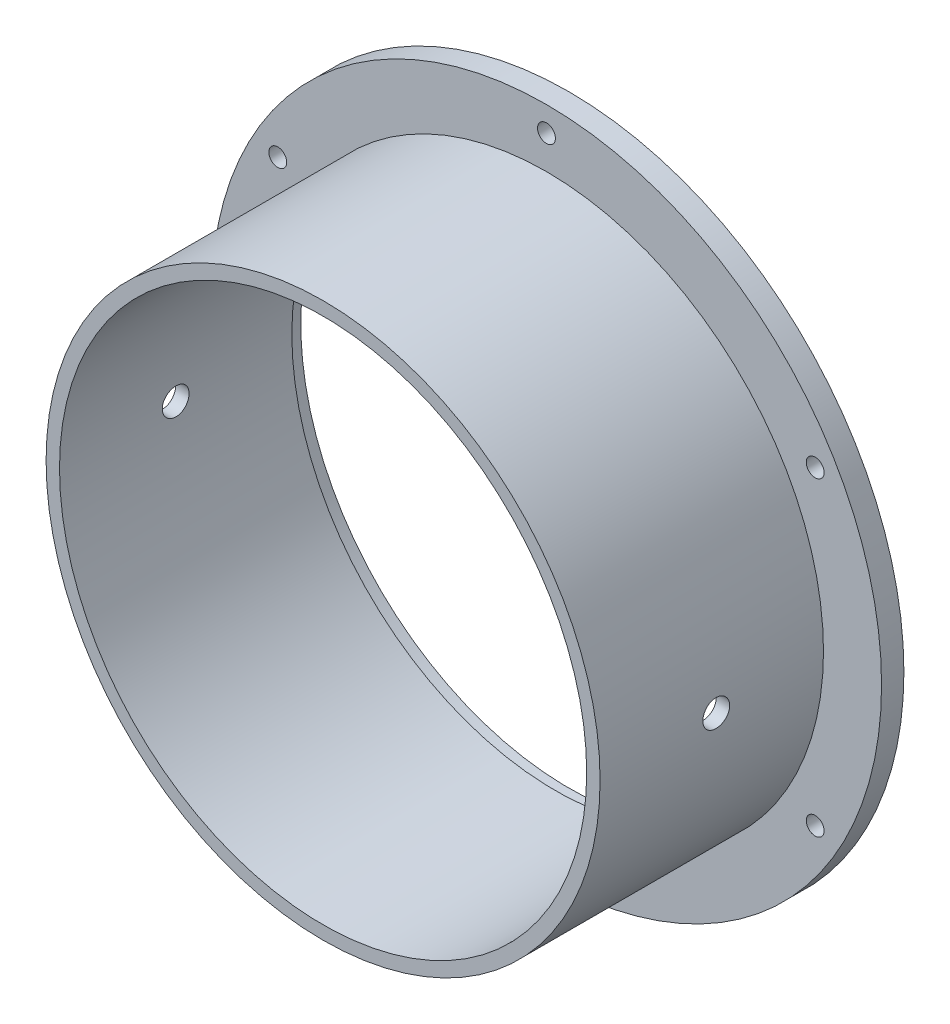
ISO-10303-21;
HEADER;
FILE_DESCRIPTION(('STEP AP214'),'2;1');
FILE_NAME('part.step','',(''),(''),'','','');
FILE_SCHEMA(('AUTOMOTIVE_DESIGN { 1 0 10303 214 1 1 1 1 }'));
ENDSEC;
DATA;
#1=APPLICATION_CONTEXT('core data for automotive mechanical design processes');
#2=APPLICATION_PROTOCOL_DEFINITION('international standard','automotive_design',2000,#1);
#3=PRODUCT_CONTEXT('',#1,'mechanical');
#4=PRODUCT('Part','Part','',(#3));
#5=PRODUCT_RELATED_PRODUCT_CATEGORY('part','',(#4));
#6=PRODUCT_DEFINITION_FORMATION('','',#4);
#7=PRODUCT_DEFINITION_CONTEXT('part definition',#1,'design');
#8=PRODUCT_DEFINITION('design','',#6,#7);
#9=PRODUCT_DEFINITION_SHAPE('','',#8);
#10=(LENGTH_UNIT() NAMED_UNIT(*) SI_UNIT(.MILLI.,.METRE.));
#11=(NAMED_UNIT(*) PLANE_ANGLE_UNIT() SI_UNIT($,.RADIAN.));
#12=(NAMED_UNIT(*) SI_UNIT($,.STERADIAN.) SOLID_ANGLE_UNIT());
#13=UNCERTAINTY_MEASURE_WITH_UNIT(LENGTH_MEASURE(1.E-05),#10,'distance_accuracy_value','');
#14=(GEOMETRIC_REPRESENTATION_CONTEXT(3) GLOBAL_UNCERTAINTY_ASSIGNED_CONTEXT((#13)) GLOBAL_UNIT_ASSIGNED_CONTEXT((#10,
#11,#12)) REPRESENTATION_CONTEXT('',''));
#15=CARTESIAN_POINT('',(0.,0.,0.));
#16=DIRECTION('',(0.,0.,1.));
#17=DIRECTION('',(1.,0.,0.));
#18=AXIS2_PLACEMENT_3D('',#15,#16,#17);
#19=CARTESIAN_POINT('',(0.,0.,3.));
#20=DIRECTION('',(0.,0.,1.));
#21=DIRECTION('',(1.,0.,0.));
#22=AXIS2_PLACEMENT_3D('',#19,#20,#21);
#23=CYLINDRICAL_SURFACE('',#22,62.);
#24=CARTESIAN_POINT('',(62.,0.,25.9999999999981));
#25=CARTESIAN_POINT('',(61.9999990282705,0.168405584694426,26.0000074346546));
#26=CARTESIAN_POINT('',(61.9993065105293,0.33693076786926,26.0142278434654));
#27=CARTESIAN_POINT('',(61.9966104956388,0.669332613043629,26.0707544795158));
#28=CARTESIAN_POINT('',(61.994605451777,0.833203552354285,26.1130938436714));
#29=CARTESIAN_POINT('',(61.9895113347211,1.15143361216737,26.2246437688027));
#30=CARTESIAN_POINT('',(61.9864228118654,1.30579751493346,26.2938406897427));
#31=CARTESIAN_POINT('',(61.9795096323139,1.60067684945553,26.4571206584221));
#32=CARTESIAN_POINT('',(61.9756851500363,1.74119555053847,26.5511978116615));
#33=CARTESIAN_POINT('',(61.9677262379046,2.00457187204135,26.7616680497545));
#34=CARTESIAN_POINT('',(61.9635915521005,2.12741465867416,26.8780796889642));
#35=CARTESIAN_POINT('',(61.9554804474584,2.351825768608,27.1298775764546));
#36=CARTESIAN_POINT('',(61.9515040350745,2.45339322505137,27.2652645975072));
#37=CARTESIAN_POINT('',(61.9441560964872,2.63241060479884,27.5512468427099));
#38=CARTESIAN_POINT('',(61.9407848579203,2.70984907249617,27.7018492458003));
#39=CARTESIAN_POINT('',(61.9350305143315,2.83833674745465,28.0139366426681));
#40=CARTESIAN_POINT('',(61.9326474021629,2.88938614558114,28.1754215577255));
#41=CARTESIAN_POINT('',(61.9291403397868,2.9636077332466,28.5045547029968));
#42=CARTESIAN_POINT('',(61.9280153955046,2.98680193216924,28.6721979591951));
#43=CARTESIAN_POINT('',(61.9271485401869,3.00472262423346,29.0090019623375));
#44=CARTESIAN_POINT('',(61.9274066187725,2.99944933100826,29.1781626978841));
#45=CARTESIAN_POINT('',(61.9292757819943,2.96060307563245,29.5130502429787));
#46=CARTESIAN_POINT('',(61.9308857297982,2.92705389153749,29.6787798179555));
#47=CARTESIAN_POINT('',(61.9352753809049,2.83264503613975,30.002252086115));
#48=CARTESIAN_POINT('',(61.9380550889164,2.77178525489684,30.1599947471431));
#49=CARTESIAN_POINT('',(61.9444722682625,2.62445561961246,30.4630920660385));
#50=CARTESIAN_POINT('',(61.9481101027522,2.53797491893829,30.6084414435716));
#51=CARTESIAN_POINT('',(61.955833137302,2.34186622526503,30.8825684973078));
#52=CARTESIAN_POINT('',(61.9599183403076,2.23223807985428,31.0113460643868));
#53=CARTESIAN_POINT('',(61.9680807151099,1.99281222336997,31.2488123792169));
#54=CARTESIAN_POINT('',(61.9721578743543,1.86299391935563,31.3574803656144));
#55=CARTESIAN_POINT('',(61.9798405768126,1.58694520703647,31.5514828675083));
#56=CARTESIAN_POINT('',(61.9834461199151,1.44071479485751,31.6368173774967));
#57=CARTESIAN_POINT('',(61.989779377416,1.1359807219657,31.781728572622));
#58=CARTESIAN_POINT('',(61.9925070673636,0.977476719551079,31.8413045403264));
#59=CARTESIAN_POINT('',(61.9967768376709,0.652700178909521,31.9329939694224));
#60=CARTESIAN_POINT('',(61.9983189263457,0.486427695175188,31.9651076234202));
#61=CARTESIAN_POINT('',(62.0000426262719,0.151014309244486,32.0009352627698));
#62=CARTESIAN_POINT('',(62.000225613243,-0.0181235186543107,32.0046779660508));
#63=CARTESIAN_POINT('',(61.9992141381796,-0.354624832727654,31.9837323961819));
#64=CARTESIAN_POINT('',(61.9980196804066,-0.521988324389978,31.9590442109908));
#65=CARTESIAN_POINT('',(61.9943887444586,-0.850109701434634,31.8819614398818));
#66=CARTESIAN_POINT('',(61.9919528537901,-1.01087067259861,31.8295799593417));
#67=CARTESIAN_POINT('',(61.9861133236389,-1.32131862326411,31.6986108014972));
#68=CARTESIAN_POINT('',(61.9827096789425,-1.47100554309801,31.6200229830041));
#69=CARTESIAN_POINT('',(61.9753141590725,-1.75518822616537,31.4387983996338));
#70=CARTESIAN_POINT('',(61.9713218137973,-1.88967169577299,31.3361423762853));
#71=CARTESIAN_POINT('',(61.963200107884,-2.139506392054,31.1097235614758));
#72=CARTESIAN_POINT('',(61.9590707464198,-2.25485750334109,30.9859606427293));
#73=CARTESIAN_POINT('',(61.9511365187236,-2.46324969892904,30.7207177148918));
#74=CARTESIAN_POINT('',(61.9473319243504,-2.55627220796065,30.579223102623));
#75=CARTESIAN_POINT('',(61.9404805205677,-2.71723968125743,30.2826071429115));
#76=CARTESIAN_POINT('',(61.9374337080167,-2.78518474948114,30.1274858519616));
#77=CARTESIAN_POINT('',(61.9324433774045,-2.89403622038222,29.8080887865041));
#78=CARTESIAN_POINT('',(61.9304993754995,-2.9349544820172,29.6438170614254));
#79=CARTESIAN_POINT('',(61.9279325195518,-2.9886296141761,29.3107254757738));
#80=CARTESIAN_POINT('',(61.9273096586392,-3.00138663113729,29.1419056388555));
#81=CARTESIAN_POINT('',(61.9274554958324,-2.99837574188345,28.8046949545071));
#82=CARTESIAN_POINT('',(61.9282227681979,-2.98263706126643,28.6363038447265));
#83=CARTESIAN_POINT('',(61.931059381138,-2.92314192964211,28.3045575852309));
#84=CARTESIAN_POINT('',(61.9331287242059,-2.87938542498392,28.14120244516));
#85=CARTESIAN_POINT('',(61.9383359271614,-2.7651026053589,27.8241587968927));
#86=CARTESIAN_POINT('',(61.9414737962463,-2.69457605996899,27.6704703719158));
#87=CARTESIAN_POINT('',(61.9484642794006,-2.52876038924218,27.3771142883325));
#88=CARTESIAN_POINT('',(61.9523168711515,-2.43347203709389,27.2374461921293));
#89=CARTESIAN_POINT('',(61.9603070583477,-2.22073368005984,26.9759498981896));
#90=CARTESIAN_POINT('',(61.9644449117105,-2.10326344818671,26.85413816464));
#91=CARTESIAN_POINT('',(61.9725375037603,-1.84950643265251,26.6319267152384));
#92=CARTESIAN_POINT('',(61.9764921971197,-1.71321502410231,26.5315322776926));
#93=CARTESIAN_POINT('',(61.983775420377,-1.42558286539214,26.3549613072945));
#94=CARTESIAN_POINT('',(61.9871033663806,-1.27422828062402,26.2788073123405));
#95=CARTESIAN_POINT('',(61.9927492244805,-0.960979046377787,26.1530827463877));
#96=CARTESIAN_POINT('',(61.9950683301062,-0.799097113685441,26.103480746392));
#97=CARTESIAN_POINT('',(61.9978211550127,-0.530173092351418,26.0452922524642));
#98=CARTESIAN_POINT('',(61.9986346356023,-0.424873250308662,26.0283293107615));
#99=CARTESIAN_POINT('',(61.9997243653067,-0.213064898847288,26.0056808369259));
#100=CARTESIAN_POINT('',(62.0000006148489,-0.106556390390614,25.9999952958182));
#101=CARTESIAN_POINT('',(62.,0.,25.9999999999981));
#102=B_SPLINE_CURVE_WITH_KNOTS('',3,(#24,#25,#26,#27,#28,#29,#30,#31,#32,#33,#34,#35,#36,#37,
#38,#39,#40,#41,#42,#43,#44,#45,#46,#47,#48,#49,#50,#51,#52,#53,#54,#55,#56,#57,#58,#59,#60,#61,
#62,#63,#64,#65,#66,#67,#68,#69,#70,#71,#72,#73,#74,#75,#76,#77,#78,#79,#80,#81,#82,#83,#84,#85,
#86,#87,#88,#89,#90,#91,#92,#93,#94,#95,#96,#97,#98,#99,#100,#101),.UNSPECIFIED.,.T.,.F.,(4,2,2,
2,2,2,2,2,2,2,2,2,2,2,2,2,2,2,2,2,2,2,2,2,2,2,2,2,2,2,2,2,2,2,2,2,2,2,4),(0.,0.504827786104315,
1.01025154704616,1.51541895569015,2.0204667896533,2.52593602280168,3.03142584715497,
3.53715529615375,4.04288108729061,4.54820702303625,5.05352916658785,5.5584267928972,
6.06332645171475,6.56844016631605,7.07355720688369,7.57919286145389,8.08482863538143,
8.59047849147991,9.09612480119103,9.60125921207214,10.106392060186,10.6112860765216,
11.116182813057,11.6214849361154,12.1267901065153,12.6325141969739,13.1382361909297,
13.6437361339803,14.1492334484468,14.6542126112339,15.1591927410007,15.6641772174819,
16.1691459276927,16.6745773469249,17.1801331865181,17.6861577101184,18.1915819319729,
18.5110052430397,18.8304282999043),.UNSPECIFIED.);
#103=CARTESIAN_POINT('',(62.,0.,25.9999999999981));
#104=VERTEX_POINT('',#103);
#105=EDGE_CURVE('E100',#104,#104,#102,.T.);
#106=ORIENTED_EDGE('',*,*,#105,.F.);
#107=EDGE_LOOP('',(#106));
#108=FACE_BOUND('',#107,.T.);
#109=CARTESIAN_POINT('',(-62.,0.,25.9999999999981));
#110=CARTESIAN_POINT('',(-61.9999990282705,-0.168405584694426,26.0000074346546));
#111=CARTESIAN_POINT('',(-61.9993065105293,-0.33693076786926,26.0142278434654));
#112=CARTESIAN_POINT('',(-61.9966104956388,-0.669332613043629,26.0707544795158));
#113=CARTESIAN_POINT('',(-61.994605451777,-0.833203552354285,26.1130938436714));
#114=CARTESIAN_POINT('',(-61.9895113347211,-1.15143361216737,26.2246437688027));
#115=CARTESIAN_POINT('',(-61.9864228118654,-1.30579751493346,26.2938406897427));
#116=CARTESIAN_POINT('',(-61.9795096323139,-1.60067684945553,26.4571206584221));
#117=CARTESIAN_POINT('',(-61.9756851500363,-1.74119555053847,26.5511978116615));
#118=CARTESIAN_POINT('',(-61.9677262379046,-2.00457187204135,26.7616680497545));
#119=CARTESIAN_POINT('',(-61.9635915521005,-2.12741465867416,26.8780796889642));
#120=CARTESIAN_POINT('',(-61.9554804474584,-2.351825768608,27.1298775764546));
#121=CARTESIAN_POINT('',(-61.9515040350745,-2.45339322505137,27.2652645975072));
#122=CARTESIAN_POINT('',(-61.9441560964872,-2.63241060479884,27.5512468427099));
#123=CARTESIAN_POINT('',(-61.9407848579203,-2.70984907249617,27.7018492458003));
#124=CARTESIAN_POINT('',(-61.9350305143315,-2.83833674745465,28.0139366426681));
#125=CARTESIAN_POINT('',(-61.9326474021629,-2.88938614558114,28.1754215577255));
#126=CARTESIAN_POINT('',(-61.9291403397868,-2.9636077332466,28.5045547029968));
#127=CARTESIAN_POINT('',(-61.9280153955046,-2.98680193216924,28.6721979591951));
#128=CARTESIAN_POINT('',(-61.9271485401869,-3.00472262423346,29.0090019623375));
#129=CARTESIAN_POINT('',(-61.9274066187725,-2.99944933100826,29.1781626978841));
#130=CARTESIAN_POINT('',(-61.9292757819943,-2.96060307563245,29.5130502429787));
#131=CARTESIAN_POINT('',(-61.9308857297982,-2.92705389153749,29.6787798179555));
#132=CARTESIAN_POINT('',(-61.9352753809049,-2.83264503613975,30.002252086115));
#133=CARTESIAN_POINT('',(-61.9380550889164,-2.77178525489684,30.1599947471431));
#134=CARTESIAN_POINT('',(-61.9444722682625,-2.62445561961246,30.4630920660385));
#135=CARTESIAN_POINT('',(-61.9481101027522,-2.53797491893829,30.6084414435716));
#136=CARTESIAN_POINT('',(-61.955833137302,-2.34186622526503,30.8825684973078));
#137=CARTESIAN_POINT('',(-61.9599183403076,-2.23223807985428,31.0113460643868));
#138=CARTESIAN_POINT('',(-61.9680807151099,-1.99281222336997,31.2488123792169));
#139=CARTESIAN_POINT('',(-61.9721578743543,-1.86299391935563,31.3574803656144));
#140=CARTESIAN_POINT('',(-61.9798405768126,-1.58694520703647,31.5514828675083));
#141=CARTESIAN_POINT('',(-61.9834461199151,-1.44071479485751,31.6368173774967));
#142=CARTESIAN_POINT('',(-61.989779377416,-1.1359807219657,31.781728572622));
#143=CARTESIAN_POINT('',(-61.9925070673636,-0.977476719551079,31.8413045403264));
#144=CARTESIAN_POINT('',(-61.9967768376709,-0.652700178909521,31.9329939694224));
#145=CARTESIAN_POINT('',(-61.9983189263457,-0.486427695175188,31.9651076234202));
#146=CARTESIAN_POINT('',(-62.0000426262719,-0.151014309244486,32.0009352627698));
#147=CARTESIAN_POINT('',(-62.000225613243,0.0181235186543107,32.0046779660508));
#148=CARTESIAN_POINT('',(-61.9992141381796,0.354624832727654,31.9837323961819));
#149=CARTESIAN_POINT('',(-61.9980196804066,0.521988324389978,31.9590442109908));
#150=CARTESIAN_POINT('',(-61.9943887444586,0.850109701434634,31.8819614398818));
#151=CARTESIAN_POINT('',(-61.9919528537901,1.01087067259861,31.8295799593417));
#152=CARTESIAN_POINT('',(-61.9861133236389,1.32131862326411,31.6986108014972));
#153=CARTESIAN_POINT('',(-61.9827096789425,1.47100554309801,31.6200229830041));
#154=CARTESIAN_POINT('',(-61.9753141590725,1.75518822616537,31.4387983996338));
#155=CARTESIAN_POINT('',(-61.9713218137973,1.88967169577299,31.3361423762853));
#156=CARTESIAN_POINT('',(-61.963200107884,2.139506392054,31.1097235614758));
#157=CARTESIAN_POINT('',(-61.9590707464198,2.25485750334109,30.9859606427293));
#158=CARTESIAN_POINT('',(-61.9511365187236,2.46324969892904,30.7207177148918));
#159=CARTESIAN_POINT('',(-61.9473319243504,2.55627220796065,30.579223102623));
#160=CARTESIAN_POINT('',(-61.9404805205677,2.71723968125743,30.2826071429115));
#161=CARTESIAN_POINT('',(-61.9374337080167,2.78518474948114,30.1274858519616));
#162=CARTESIAN_POINT('',(-61.9324433774045,2.89403622038222,29.8080887865041));
#163=CARTESIAN_POINT('',(-61.9304993754995,2.9349544820172,29.6438170614254));
#164=CARTESIAN_POINT('',(-61.9279325195518,2.9886296141761,29.3107254757738));
#165=CARTESIAN_POINT('',(-61.9273096586392,3.00138663113729,29.1419056388555));
#166=CARTESIAN_POINT('',(-61.9274554958324,2.99837574188345,28.8046949545071));
#167=CARTESIAN_POINT('',(-61.9282227681979,2.98263706126643,28.6363038447265));
#168=CARTESIAN_POINT('',(-61.931059381138,2.92314192964211,28.3045575852309));
#169=CARTESIAN_POINT('',(-61.9331287242059,2.87938542498392,28.14120244516));
#170=CARTESIAN_POINT('',(-61.9383359271614,2.7651026053589,27.8241587968927));
#171=CARTESIAN_POINT('',(-61.9414737962463,2.69457605996899,27.6704703719158));
#172=CARTESIAN_POINT('',(-61.9484642794006,2.52876038924218,27.3771142883325));
#173=CARTESIAN_POINT('',(-61.9523168711515,2.43347203709389,27.2374461921293));
#174=CARTESIAN_POINT('',(-61.9603070583477,2.22073368005984,26.9759498981896));
#175=CARTESIAN_POINT('',(-61.9644449117105,2.10326344818671,26.85413816464));
#176=CARTESIAN_POINT('',(-61.9725375037603,1.84950643265251,26.6319267152384));
#177=CARTESIAN_POINT('',(-61.9764921971197,1.71321502410231,26.5315322776926));
#178=CARTESIAN_POINT('',(-61.983775420377,1.42558286539214,26.3549613072945));
#179=CARTESIAN_POINT('',(-61.9871033663806,1.27422828062402,26.2788073123405));
#180=CARTESIAN_POINT('',(-61.9927492244805,0.960979046377787,26.1530827463877));
#181=CARTESIAN_POINT('',(-61.9950683301062,0.799097113685441,26.103480746392));
#182=CARTESIAN_POINT('',(-61.9978211550127,0.530173092351418,26.0452922524642));
#183=CARTESIAN_POINT('',(-61.9986346356023,0.424873250308662,26.0283293107615));
#184=CARTESIAN_POINT('',(-61.9997243653067,0.213064898847288,26.0056808369259));
#185=CARTESIAN_POINT('',(-62.0000006148489,0.106556390390614,25.9999952958182));
#186=CARTESIAN_POINT('',(-62.,0.,25.9999999999981));
#187=B_SPLINE_CURVE_WITH_KNOTS('',3,(#109,#110,#111,#112,#113,#114,#115,#116,#117,#118,#119,
#120,#121,#122,#123,#124,#125,#126,#127,#128,#129,#130,#131,#132,#133,#134,#135,#136,#137,#138,
#139,#140,#141,#142,#143,#144,#145,#146,#147,#148,#149,#150,#151,#152,#153,#154,#155,#156,#157,
#158,#159,#160,#161,#162,#163,#164,#165,#166,#167,#168,#169,#170,#171,#172,#173,#174,#175,#176,
#177,#178,#179,#180,#181,#182,#183,#184,#185,#186),.UNSPECIFIED.,.T.,.F.,(4,2,2,2,2,2,2,2,2,2,2,
2,2,2,2,2,2,2,2,2,2,2,2,2,2,2,2,2,2,2,2,2,2,2,2,2,2,2,4),(0.,0.504827786104315,1.01025154704616,
1.51541895569015,2.0204667896533,2.52593602280168,3.03142584715497,3.53715529615375,
4.04288108729061,4.54820702303625,5.05352916658785,5.5584267928972,6.06332645171475,
6.56844016631605,7.07355720688369,7.57919286145389,8.08482863538143,8.59047849147991,
9.09612480119103,9.60125921207214,10.106392060186,10.6112860765216,11.116182813057,
11.6214849361154,12.1267901065153,12.6325141969739,13.1382361909297,13.6437361339803,
14.1492334484468,14.6542126112339,15.1591927410007,15.6641772174819,16.1691459276927,
16.6745773469249,17.1801331865181,17.6861577101184,18.1915819319729,18.5110052430397,
18.8304282999043),.UNSPECIFIED.);
#188=CARTESIAN_POINT('',(-62.,0.,25.9999999999981));
#189=VERTEX_POINT('',#188);
#190=EDGE_CURVE('E94',#189,#189,#187,.T.);
#191=ORIENTED_EDGE('',*,*,#190,.F.);
#192=EDGE_LOOP('',(#191));
#193=FACE_BOUND('',#192,.T.);
#194=CARTESIAN_POINT('',(0.,0.,3.));
#195=DIRECTION('',(0.,0.,1.));
#196=DIRECTION('',(1.,0.,0.));
#197=AXIS2_PLACEMENT_3D('',#194,#195,#196);
#198=CIRCLE('',#197,62.);
#199=CARTESIAN_POINT('',(62.,0.,3.));
#200=VERTEX_POINT('',#199);
#201=EDGE_CURVE('E11',#200,#200,#198,.T.);
#202=ORIENTED_EDGE('',*,*,#201,.T.);
#203=EDGE_LOOP('',(#202));
#204=FACE_BOUND('',#203,.T.);
#205=CARTESIAN_POINT('',(0.,0.,55.));
#206=DIRECTION('',(0.,0.,1.));
#207=DIRECTION('',(1.,0.,0.));
#208=AXIS2_PLACEMENT_3D('',#205,#206,#207);
#209=CIRCLE('',#208,62.);
#210=CARTESIAN_POINT('',(62.,0.,55.));
#211=VERTEX_POINT('',#210);
#212=EDGE_CURVE('E71',#211,#211,#209,.T.);
#213=ORIENTED_EDGE('',*,*,#212,.F.);
#214=EDGE_LOOP('',(#213));
#215=FACE_BOUND('',#214,.T.);
#216=ADVANCED_FACE('F51',(#108,#193,#204,#215),#23,.T.);
#217=CARTESIAN_POINT('',(0.,0.,3.));
#218=DIRECTION('',(0.,0.,1.));
#219=DIRECTION('',(1.,0.,0.));
#220=AXIS2_PLACEMENT_3D('',#217,#218,#219);
#221=PLANE('',#220);
#222=CARTESIAN_POINT('',(0.,0.,3.));
#223=DIRECTION('',(0.,0.,1.));
#224=DIRECTION('',(1.,0.,0.));
#225=AXIS2_PLACEMENT_3D('',#222,#223,#224);
#226=CIRCLE('',#225,59.);
#227=CARTESIAN_POINT('',(59.,0.,3.));
#228=VERTEX_POINT('',#227);
#229=EDGE_CURVE('E65',#228,#228,#226,.T.);
#230=ORIENTED_EDGE('',*,*,#229,.T.);
#231=EDGE_LOOP('',(#230));
#232=FACE_BOUND('',#231,.T.);
#233=ORIENTED_EDGE('',*,*,#201,.F.);
#234=EDGE_LOOP('',(#233));
#235=FACE_BOUND('',#234,.T.);
#236=ADVANCED_FACE('F117',(#232,#235),#221,.F.);
#237=CARTESIAN_POINT('',(0.,0.,3.));
#238=DIRECTION('',(0.,0.,1.));
#239=DIRECTION('',(1.,0.,0.));
#240=AXIS2_PLACEMENT_3D('',#237,#238,#239);
#241=CYLINDRICAL_SURFACE('',#240,59.);
#242=CARTESIAN_POINT('',(59.,0.,25.9999999999981));
#243=CARTESIAN_POINT('',(58.9999989799703,0.168394569983671,26.0000074304365));
#244=CARTESIAN_POINT('',(58.9992713456249,0.336908468403887,26.0142259865892));
#245=CARTESIAN_POINT('',(58.9964386198972,0.669287299852841,26.0707448345516));
#246=CARTESIAN_POINT('',(58.9943319067938,0.833146522239599,26.1130781886755));
#247=CARTESIAN_POINT('',(58.988979460907,1.15135309100939,26.2246112135983));
#248=CARTESIAN_POINT('',(58.9857343099237,1.30570524871247,26.2937971632625));
#249=CARTESIAN_POINT('',(58.9784704407145,1.60056341321387,26.4570502895163));
#250=CARTESIAN_POINT('',(58.9744519048273,1.74107267193039,26.5511116032643));
#251=CARTESIAN_POINT('',(58.9660886331905,2.00444433798885,26.7615541491007));
#252=CARTESIAN_POINT('',(58.9617436038348,2.12729056518276,26.8779556208034));
#253=CARTESIAN_POINT('',(58.9532195864047,2.35171109608138,27.129733755195));
#254=CARTESIAN_POINT('',(58.9490406051279,2.45328452964067,27.2651111937017));
#255=CARTESIAN_POINT('',(58.9413178390016,2.63232123068405,27.5510838408634));
#256=CARTESIAN_POINT('',(58.9377743892411,2.70977179494977,27.7016870123568));
#257=CARTESIAN_POINT('',(58.9317258680638,2.83828274030639,28.0137800214008));
#258=CARTESIAN_POINT('',(58.929220788568,2.88934332672554,28.1752697742368));
#259=CARTESIAN_POINT('',(58.9255341665118,2.96358196352316,28.504402399602));
#260=CARTESIAN_POINT('',(58.9243514702345,2.98678432020163,28.6720397765109));
#261=CARTESIAN_POINT('',(58.9234395218282,3.00472286400121,29.008833819608));
#262=CARTESIAN_POINT('',(58.9237102579262,2.99945928169969,29.1779904734789));
#263=CARTESIAN_POINT('',(58.9256735714888,2.96063560371543,29.5128560946307));
#264=CARTESIAN_POINT('',(58.927364829198,2.92710177279032,29.6785681158073));
#265=CARTESIAN_POINT('',(58.9319764876455,2.83273020392488,30.0020078568875));
#266=CARTESIAN_POINT('',(58.9348968937099,2.77189234766839,30.1597355421894));
#267=CARTESIAN_POINT('',(58.9416392173527,2.62460970765247,30.4628138993411));
#268=CARTESIAN_POINT('',(58.9454615561979,2.53815295320375,30.6081587442161));
#269=CARTESIAN_POINT('',(58.9535765051503,2.34209542529611,30.8822818818552));
#270=CARTESIAN_POINT('',(58.957869118696,2.23249448261152,31.0110600534761));
#271=CARTESIAN_POINT('',(58.9664466673957,1.99311154758629,31.2485471717735));
#272=CARTESIAN_POINT('',(58.9707315883228,1.86330681156642,31.3572331950498));
#273=CARTESIAN_POINT('',(58.9788061154376,1.58728088954849,31.551274166346));
#274=CARTESIAN_POINT('',(58.9825957215007,1.44105969942226,31.6366291084991));
#275=CARTESIAN_POINT('',(58.9892527022312,1.13633811355878,31.7815828210593));
#276=CARTESIAN_POINT('',(58.9921200481079,0.97783733467381,31.8411807874153));
#277=CARTESIAN_POINT('',(58.9966089392041,0.653061792256523,31.9329137769074));
#278=CARTESIAN_POINT('',(58.9982304940673,0.486787088912042,31.9650490126303));
#279=CARTESIAN_POINT('',(59.0000438130842,0.15138262563183,32.0009160769948));
#280=CARTESIAN_POINT('',(59.0002371732896,-0.0177437354869274,32.0046796119883));
#281=CARTESIAN_POINT('',(58.9991765491366,-0.354225569494889,31.983779191085));
#282=CARTESIAN_POINT('',(58.9979225697316,-0.521581048442711,31.9591153324768));
#283=CARTESIAN_POINT('',(58.9941095284007,-0.849681633938822,31.8820864842079));
#284=CARTESIAN_POINT('',(58.991551148758,-1.01043014889063,31.829735975867));
#285=CARTESIAN_POINT('',(58.9854173326871,-1.320858751014,31.6988345505118));
#286=CARTESIAN_POINT('',(58.9818418902028,-1.47053877227109,31.6202834774847));
#287=CARTESIAN_POINT('',(58.9740721635391,-1.75472707985035,31.4391295522441));
#288=CARTESIAN_POINT('',(58.9698773338491,-1.88922180592351,31.3365054508969));
#289=CARTESIAN_POINT('',(58.9613430508491,-2.13908535649585,31.1101496296294));
#290=CARTESIAN_POINT('',(58.9570035965815,-2.25445405431534,30.9864177699146));
#291=CARTESIAN_POINT('',(58.9486646088514,-2.46289743785975,30.7212223046389));
#292=CARTESIAN_POINT('',(58.9446653903901,-2.55595160593985,30.5797425609833));
#293=CARTESIAN_POINT('',(58.9374628045142,-2.71698422460336,30.2831489366034));
#294=CARTESIAN_POINT('',(58.9342594335476,-2.78496278710421,30.1280351167345));
#295=CARTESIAN_POINT('',(58.9290120233058,-2.89387877329996,29.8086524003012));
#296=CARTESIAN_POINT('',(58.926967423754,-2.93482926689449,29.6443879704102));
#297=CARTESIAN_POINT('',(58.9242665451229,-2.98856942464809,29.3113044178766));
#298=CARTESIAN_POINT('',(58.9236102578044,-3.00135925593344,29.1424853222708));
#299=CARTESIAN_POINT('',(58.9237602156479,-2.99841344769524,28.8052888164314));
#300=CARTESIAN_POINT('',(58.9245648059712,-2.98271008442669,28.6369111225349));
#301=CARTESIAN_POINT('',(58.9275423392412,-2.92329037881186,28.3051859857805));
#302=CARTESIAN_POINT('',(58.9297152847889,-2.87957398321728,28.1418385524849));
#303=CARTESIAN_POINT('',(58.9351842481438,-2.76537580321974,27.8248041477206));
#304=CARTESIAN_POINT('',(58.9384802733908,-2.69489384150948,27.6711172402555));
#305=CARTESIAN_POINT('',(58.945823810921,-2.52917072610544,27.3777559591063));
#306=CARTESIAN_POINT('',(58.9498713003648,-2.43393032486842,27.2380811597459));
#307=CARTESIAN_POINT('',(58.958266824079,-2.22127793833461,26.9765475164985));
#308=CARTESIAN_POINT('',(58.9626151614793,-2.1038433780687,26.8547070388328));
#309=CARTESIAN_POINT('',(58.9711201167231,-1.85015248870543,26.6324317085829));
#310=CARTESIAN_POINT('',(58.9752766871544,-1.71389153791384,26.5320021276066));
#311=CARTESIAN_POINT('',(58.9829326909244,-1.42630595751836,26.3553508338403));
#312=CARTESIAN_POINT('',(58.9864314796385,-1.27496677114905,26.2791528178925));
#313=CARTESIAN_POINT('',(58.992368099352,-0.961738427651268,26.1533387657515));
#314=CARTESIAN_POINT('',(58.9948071822206,-0.799861980062454,26.1036913482622));
#315=CARTESIAN_POINT('',(58.9977047852369,-0.530817264619173,26.045403209939));
#316=CARTESIAN_POINT('',(58.9985617055917,-0.42539143513257,26.0283987603987));
#317=CARTESIAN_POINT('',(58.9997096358451,-0.213326368846096,26.0056948066335));
#318=CARTESIAN_POINT('',(59.0000006462444,-0.106687133119444,25.9999952924105));
#319=CARTESIAN_POINT('',(59.,0.,25.9999999999981));
#320=B_SPLINE_CURVE_WITH_KNOTS('',3,(#242,#243,#244,#245,#246,#247,#248,#249,#250,#251,#252,
#253,#254,#255,#256,#257,#258,#259,#260,#261,#262,#263,#264,#265,#266,#267,#268,#269,#270,#271,
#272,#273,#274,#275,#276,#277,#278,#279,#280,#281,#282,#283,#284,#285,#286,#287,#288,#289,#290,
#291,#292,#293,#294,#295,#296,#297,#298,#299,#300,#301,#302,#303,#304,#305,#306,#307,#308,#309,
#310,#311,#312,#313,#314,#315,#316,#317,#318,#319),.UNSPECIFIED.,.T.,.F.,(4,2,2,2,2,2,2,2,2,2,2,
2,2,2,2,2,2,2,2,2,2,2,2,2,2,2,2,2,2,2,2,2,2,2,2,2,2,2,4),(0.,0.504794260690021,1.01018320070209,
1.51531423643009,2.02032632443246,2.52579811892379,3.03129058526986,3.53704879804754,
4.0428030756947,4.54811576142266,5.05342435406612,5.55826400140788,6.06310583638562,
6.56818393679258,7.07326573035767,7.57892026921534,8.08457493522764,8.59024538503586,
9.09591192045411,9.60101327222869,10.10611289537,10.6109485903776,11.1157872915127,
11.621073299151,12.1263626533765,12.6321148420745,13.1378647734724,13.6433699610349,
14.1488721485462,14.6538020754514,15.1587329621505,15.6636671938003,16.1685860813181,
16.6740213425698,17.1795809044174,17.6856333599044,18.1910863608001,18.5109013056811,
18.8307159677179),.UNSPECIFIED.);
#321=CARTESIAN_POINT('',(59.,0.,25.9999999999981));
#322=VERTEX_POINT('',#321);
#323=EDGE_CURVE('E55',#322,#322,#320,.T.);
#324=ORIENTED_EDGE('',*,*,#323,.T.);
#325=EDGE_LOOP('',(#324));
#326=FACE_BOUND('',#325,.T.);
#327=CARTESIAN_POINT('',(-59.,0.,25.9999999999981));
#328=CARTESIAN_POINT('',(-58.9999989799703,-0.168394569983671,26.0000074304365));
#329=CARTESIAN_POINT('',(-58.9992713456249,-0.336908468403887,26.0142259865892));
#330=CARTESIAN_POINT('',(-58.9964386198972,-0.669287299852841,26.0707448345516));
#331=CARTESIAN_POINT('',(-58.9943319067938,-0.833146522239599,26.1130781886755));
#332=CARTESIAN_POINT('',(-58.988979460907,-1.15135309100939,26.2246112135983));
#333=CARTESIAN_POINT('',(-58.9857343099237,-1.30570524871247,26.2937971632625));
#334=CARTESIAN_POINT('',(-58.9784704407145,-1.60056341321387,26.4570502895163));
#335=CARTESIAN_POINT('',(-58.9744519048273,-1.74107267193039,26.5511116032643));
#336=CARTESIAN_POINT('',(-58.9660886331905,-2.00444433798885,26.7615541491007));
#337=CARTESIAN_POINT('',(-58.9617436038348,-2.12729056518276,26.8779556208034));
#338=CARTESIAN_POINT('',(-58.9532195864047,-2.35171109608138,27.129733755195));
#339=CARTESIAN_POINT('',(-58.9490406051279,-2.45328452964067,27.2651111937017));
#340=CARTESIAN_POINT('',(-58.9413178390016,-2.63232123068405,27.5510838408634));
#341=CARTESIAN_POINT('',(-58.9377743892411,-2.70977179494977,27.7016870123568));
#342=CARTESIAN_POINT('',(-58.9317258680638,-2.83828274030639,28.0137800214008));
#343=CARTESIAN_POINT('',(-58.929220788568,-2.88934332672554,28.1752697742368));
#344=CARTESIAN_POINT('',(-58.9255341665118,-2.96358196352316,28.504402399602));
#345=CARTESIAN_POINT('',(-58.9243514702345,-2.98678432020163,28.6720397765109));
#346=CARTESIAN_POINT('',(-58.9234395218282,-3.00472286400121,29.008833819608));
#347=CARTESIAN_POINT('',(-58.9237102579262,-2.99945928169969,29.1779904734789));
#348=CARTESIAN_POINT('',(-58.9256735714888,-2.96063560371543,29.5128560946307));
#349=CARTESIAN_POINT('',(-58.927364829198,-2.92710177279032,29.6785681158073));
#350=CARTESIAN_POINT('',(-58.9319764876455,-2.83273020392488,30.0020078568875));
#351=CARTESIAN_POINT('',(-58.9348968937099,-2.77189234766839,30.1597355421894));
#352=CARTESIAN_POINT('',(-58.9416392173527,-2.62460970765247,30.4628138993411));
#353=CARTESIAN_POINT('',(-58.9454615561979,-2.53815295320375,30.6081587442161));
#354=CARTESIAN_POINT('',(-58.9535765051503,-2.34209542529611,30.8822818818552));
#355=CARTESIAN_POINT('',(-58.957869118696,-2.23249448261152,31.0110600534761));
#356=CARTESIAN_POINT('',(-58.9664466673957,-1.99311154758629,31.2485471717735));
#357=CARTESIAN_POINT('',(-58.9707315883228,-1.86330681156642,31.3572331950498));
#358=CARTESIAN_POINT('',(-58.9788061154376,-1.58728088954849,31.551274166346));
#359=CARTESIAN_POINT('',(-58.9825957215007,-1.44105969942226,31.6366291084991));
#360=CARTESIAN_POINT('',(-58.9892527022312,-1.13633811355878,31.7815828210593));
#361=CARTESIAN_POINT('',(-58.9921200481079,-0.97783733467381,31.8411807874153));
#362=CARTESIAN_POINT('',(-58.9966089392041,-0.653061792256523,31.9329137769074));
#363=CARTESIAN_POINT('',(-58.9982304940673,-0.486787088912042,31.9650490126303));
#364=CARTESIAN_POINT('',(-59.0000438130842,-0.15138262563183,32.0009160769948));
#365=CARTESIAN_POINT('',(-59.0002371732896,0.0177437354869274,32.0046796119883));
#366=CARTESIAN_POINT('',(-58.9991765491366,0.354225569494889,31.983779191085));
#367=CARTESIAN_POINT('',(-58.9979225697316,0.521581048442711,31.9591153324768));
#368=CARTESIAN_POINT('',(-58.9941095284007,0.849681633938822,31.8820864842079));
#369=CARTESIAN_POINT('',(-58.991551148758,1.01043014889063,31.829735975867));
#370=CARTESIAN_POINT('',(-58.9854173326871,1.320858751014,31.6988345505118));
#371=CARTESIAN_POINT('',(-58.9818418902028,1.47053877227109,31.6202834774847));
#372=CARTESIAN_POINT('',(-58.9740721635391,1.75472707985035,31.4391295522441));
#373=CARTESIAN_POINT('',(-58.9698773338491,1.88922180592351,31.3365054508969));
#374=CARTESIAN_POINT('',(-58.9613430508491,2.13908535649585,31.1101496296294));
#375=CARTESIAN_POINT('',(-58.9570035965815,2.25445405431534,30.9864177699146));
#376=CARTESIAN_POINT('',(-58.9486646088514,2.46289743785975,30.7212223046389));
#377=CARTESIAN_POINT('',(-58.9446653903901,2.55595160593985,30.5797425609833));
#378=CARTESIAN_POINT('',(-58.9374628045142,2.71698422460336,30.2831489366034));
#379=CARTESIAN_POINT('',(-58.9342594335476,2.78496278710421,30.1280351167345));
#380=CARTESIAN_POINT('',(-58.9290120233058,2.89387877329996,29.8086524003012));
#381=CARTESIAN_POINT('',(-58.926967423754,2.93482926689449,29.6443879704102));
#382=CARTESIAN_POINT('',(-58.9242665451229,2.98856942464809,29.3113044178766));
#383=CARTESIAN_POINT('',(-58.9236102578044,3.00135925593344,29.1424853222708));
#384=CARTESIAN_POINT('',(-58.9237602156479,2.99841344769524,28.8052888164314));
#385=CARTESIAN_POINT('',(-58.9245648059712,2.98271008442669,28.6369111225349));
#386=CARTESIAN_POINT('',(-58.9275423392412,2.92329037881186,28.3051859857805));
#387=CARTESIAN_POINT('',(-58.9297152847889,2.87957398321728,28.1418385524849));
#388=CARTESIAN_POINT('',(-58.9351842481438,2.76537580321974,27.8248041477206));
#389=CARTESIAN_POINT('',(-58.9384802733908,2.69489384150948,27.6711172402555));
#390=CARTESIAN_POINT('',(-58.945823810921,2.52917072610544,27.3777559591063));
#391=CARTESIAN_POINT('',(-58.9498713003648,2.43393032486842,27.2380811597459));
#392=CARTESIAN_POINT('',(-58.958266824079,2.22127793833461,26.9765475164985));
#393=CARTESIAN_POINT('',(-58.9626151614793,2.1038433780687,26.8547070388328));
#394=CARTESIAN_POINT('',(-58.9711201167231,1.85015248870543,26.6324317085829));
#395=CARTESIAN_POINT('',(-58.9752766871544,1.71389153791384,26.5320021276066));
#396=CARTESIAN_POINT('',(-58.9829326909244,1.42630595751836,26.3553508338403));
#397=CARTESIAN_POINT('',(-58.9864314796385,1.27496677114905,26.2791528178925));
#398=CARTESIAN_POINT('',(-58.992368099352,0.961738427651268,26.1533387657515));
#399=CARTESIAN_POINT('',(-58.9948071822206,0.799861980062454,26.1036913482622));
#400=CARTESIAN_POINT('',(-58.9977047852369,0.530817264619173,26.045403209939));
#401=CARTESIAN_POINT('',(-58.9985617055917,0.42539143513257,26.0283987603987));
#402=CARTESIAN_POINT('',(-58.9997096358451,0.213326368846096,26.0056948066335));
#403=CARTESIAN_POINT('',(-59.0000006462444,0.106687133119444,25.9999952924105));
#404=CARTESIAN_POINT('',(-59.,0.,25.9999999999981));
#405=B_SPLINE_CURVE_WITH_KNOTS('',3,(#327,#328,#329,#330,#331,#332,#333,#334,#335,#336,#337,
#338,#339,#340,#341,#342,#343,#344,#345,#346,#347,#348,#349,#350,#351,#352,#353,#354,#355,#356,
#357,#358,#359,#360,#361,#362,#363,#364,#365,#366,#367,#368,#369,#370,#371,#372,#373,#374,#375,
#376,#377,#378,#379,#380,#381,#382,#383,#384,#385,#386,#387,#388,#389,#390,#391,#392,#393,#394,
#395,#396,#397,#398,#399,#400,#401,#402,#403,#404),.UNSPECIFIED.,.T.,.F.,(4,2,2,2,2,2,2,2,2,2,2,
2,2,2,2,2,2,2,2,2,2,2,2,2,2,2,2,2,2,2,2,2,2,2,2,2,2,2,4),(0.,0.504794260690021,1.01018320070209,
1.51531423643009,2.02032632443246,2.52579811892379,3.03129058526986,3.53704879804754,
4.0428030756947,4.54811576142266,5.05342435406612,5.55826400140788,6.06310583638562,
6.56818393679258,7.07326573035767,7.57892026921534,8.08457493522764,8.59024538503586,
9.09591192045411,9.60101327222869,10.10611289537,10.6109485903776,11.1157872915127,
11.621073299151,12.1263626533765,12.6321148420745,13.1378647734724,13.6433699610349,
14.1488721485462,14.6538020754514,15.1587329621505,15.6636671938003,16.1685860813181,
16.6740213425698,17.1795809044174,17.6856333599044,18.1910863608001,18.5109013056811,
18.8307159677179),.UNSPECIFIED.);
#406=CARTESIAN_POINT('',(-59.,0.,25.9999999999981));
#407=VERTEX_POINT('',#406);
#408=EDGE_CURVE('E74',#407,#407,#405,.T.);
#409=ORIENTED_EDGE('',*,*,#408,.T.);
#410=EDGE_LOOP('',(#409));
#411=FACE_BOUND('',#410,.T.);
#412=ORIENTED_EDGE('',*,*,#229,.F.);
#413=EDGE_LOOP('',(#412));
#414=FACE_BOUND('',#413,.T.);
#415=CARTESIAN_POINT('',(0.,0.,55.));
#416=DIRECTION('',(0.,0.,1.));
#417=DIRECTION('',(1.,0.,0.));
#418=AXIS2_PLACEMENT_3D('',#415,#416,#417);
#419=CIRCLE('',#418,59.);
#420=CARTESIAN_POINT('',(59.,0.,55.));
#421=VERTEX_POINT('',#420);
#422=EDGE_CURVE('E107',#421,#421,#419,.T.);
#423=ORIENTED_EDGE('',*,*,#422,.T.);
#424=EDGE_LOOP('',(#423));
#425=FACE_BOUND('',#424,.T.);
#426=ADVANCED_FACE('F80',(#326,#411,#414,#425),#241,.F.);
#427=CARTESIAN_POINT('',(0.,0.,55.));
#428=DIRECTION('',(0.,0.,1.));
#429=DIRECTION('',(1.,0.,0.));
#430=AXIS2_PLACEMENT_3D('',#427,#428,#429);
#431=PLANE('',#430);
#432=ORIENTED_EDGE('',*,*,#212,.T.);
#433=EDGE_LOOP('',(#432));
#434=FACE_BOUND('',#433,.T.);
#435=ORIENTED_EDGE('',*,*,#422,.F.);
#436=EDGE_LOOP('',(#435));
#437=FACE_BOUND('',#436,.T.);
#438=ADVANCED_FACE('F88',(#434,#437),#431,.T.);
#439=CARTESIAN_POINT('',(-75.,0.,28.9999999999981));
#440=DIRECTION('',(1.,0.,0.));
#441=DIRECTION('',(0.,0.,-1.));
#442=AXIS2_PLACEMENT_3D('',#439,#440,#441);
#443=CYLINDRICAL_SURFACE('',#442,3.);
#444=ORIENTED_EDGE('',*,*,#190,.T.);
#445=EDGE_LOOP('',(#444));
#446=FACE_BOUND('',#445,.T.);
#447=ORIENTED_EDGE('',*,*,#408,.F.);
#448=EDGE_LOOP('',(#447));
#449=FACE_BOUND('',#448,.T.);
#450=ADVANCED_FACE('F86',(#446,#449),#443,.F.);
#451=ORIENTED_EDGE('',*,*,#105,.T.);
#452=EDGE_LOOP('',(#451));
#453=FACE_BOUND('',#452,.T.);
#454=ORIENTED_EDGE('',*,*,#323,.F.);
#455=EDGE_LOOP('',(#454));
#456=FACE_BOUND('',#455,.T.);
#457=ADVANCED_FACE('F83',(#453,#456),#443,.F.);
#458=CLOSED_SHELL('',(#216,#236,#426,#438,#450,#457));
#459=MANIFOLD_SOLID_BREP('B2',#458);
#460=CARTESIAN_POINT('',(0.,0.,5.));
#461=DIRECTION('',(0.,0.,1.));
#462=DIRECTION('',(1.,0.,0.));
#463=AXIS2_PLACEMENT_3D('',#460,#461,#462);
#464=PLANE('',#463);
#465=CARTESIAN_POINT('',(0.,69.4428035790793,5.));
#466=DIRECTION('',(0.,0.,1.));
#467=DIRECTION('',(1.,0.,0.));
#468=AXIS2_PLACEMENT_3D('',#465,#466,#467);
#469=CIRCLE('',#468,2.);
#470=CARTESIAN_POINT('',(2.00000000000002,69.4428035790793,5.));
#471=VERTEX_POINT('',#470);
#472=EDGE_CURVE('E226',#471,#471,#469,.T.);
#473=ORIENTED_EDGE('',*,*,#472,.F.);
#474=EDGE_LOOP('',(#473));
#475=FACE_BOUND('',#474,.T.);
#476=CARTESIAN_POINT('',(-60.1392320094952,34.7214017895404,5.));
#477=DIRECTION('',(0.,0.,1.));
#478=DIRECTION('',(1.,0.,0.));
#479=AXIS2_PLACEMENT_3D('',#476,#477,#478);
#480=CIRCLE('',#479,2.);
#481=CARTESIAN_POINT('',(-58.1392320094952,34.7214017895404,5.));
#482=VERTEX_POINT('',#481);
#483=EDGE_CURVE('E205',#482,#482,#480,.T.);
#484=ORIENTED_EDGE('',*,*,#483,.F.);
#485=EDGE_LOOP('',(#484));
#486=FACE_BOUND('',#485,.T.);
#487=CARTESIAN_POINT('',(-60.1392320094959,-34.7214017895391,5.));
#488=DIRECTION('',(0.,0.,1.));
#489=DIRECTION('',(1.,0.,0.));
#490=AXIS2_PLACEMENT_3D('',#487,#488,#489);
#491=CIRCLE('',#490,2.);
#492=CARTESIAN_POINT('',(-58.1392320094959,-34.7214017895391,5.));
#493=VERTEX_POINT('',#492);
#494=EDGE_CURVE('E204',#493,#493,#491,.T.);
#495=ORIENTED_EDGE('',*,*,#494,.F.);
#496=EDGE_LOOP('',(#495));
#497=FACE_BOUND('',#496,.T.);
#498=CARTESIAN_POINT('',(-5.03979073086054E-13,-69.4428035790793,5.));
#499=DIRECTION('',(0.,0.,1.));
#500=DIRECTION('',(1.,0.,0.));
#501=AXIS2_PLACEMENT_3D('',#498,#499,#500);
#502=CIRCLE('',#501,2.);
#503=CARTESIAN_POINT('',(1.9999999999995,-69.4428035790793,5.));
#504=VERTEX_POINT('',#503);
#505=EDGE_CURVE('E211',#504,#504,#502,.T.);
#506=ORIENTED_EDGE('',*,*,#505,.F.);
#507=EDGE_LOOP('',(#506));
#508=FACE_BOUND('',#507,.T.);
#509=CARTESIAN_POINT('',(60.1392320094954,-34.7214017895399,5.));
#510=DIRECTION('',(0.,0.,1.));
#511=DIRECTION('',(1.,0.,0.));
#512=AXIS2_PLACEMENT_3D('',#509,#510,#511);
#513=CIRCLE('',#512,2.);
#514=CARTESIAN_POINT('',(62.1392320094954,-34.7214017895399,5.));
#515=VERTEX_POINT('',#514);
#516=EDGE_CURVE('E217',#515,#515,#513,.T.);
#517=ORIENTED_EDGE('',*,*,#516,.F.);
#518=EDGE_LOOP('',(#517));
#519=FACE_BOUND('',#518,.T.);
#520=CARTESIAN_POINT('',(60.1392320094957,34.7214017895395,5.));
#521=DIRECTION('',(0.,0.,1.));
#522=DIRECTION('',(1.,0.,0.));
#523=AXIS2_PLACEMENT_3D('',#520,#521,#522);
#524=CIRCLE('',#523,2.);
#525=CARTESIAN_POINT('',(62.1392320094957,34.7214017895395,5.));
#526=VERTEX_POINT('',#525);
#527=EDGE_CURVE('E223',#526,#526,#524,.T.);
#528=ORIENTED_EDGE('',*,*,#527,.F.);
#529=EDGE_LOOP('',(#528));
#530=FACE_BOUND('',#529,.T.);
#531=CARTESIAN_POINT('',(0.,0.,5.));
#532=DIRECTION('',(0.,0.,1.));
#533=DIRECTION('',(1.,0.,0.));
#534=AXIS2_PLACEMENT_3D('',#531,#532,#533);
#535=CIRCLE('',#534,75.);
#536=CARTESIAN_POINT('',(75.,0.,5.));
#537=VERTEX_POINT('',#536);
#538=EDGE_CURVE('E50',#537,#537,#535,.T.);
#539=ORIENTED_EDGE('',*,*,#538,.T.);
#540=EDGE_LOOP('',(#539));
#541=FACE_BOUND('',#540,.T.);
#542=CARTESIAN_POINT('',(0.,0.,5.));
#543=DIRECTION('',(0.,0.,1.));
#544=DIRECTION('',(1.,0.,0.));
#545=AXIS2_PLACEMENT_3D('',#542,#543,#544);
#546=CIRCLE('',#545,60.);
#547=CARTESIAN_POINT('',(60.,0.,5.));
#548=VERTEX_POINT('',#547);
#549=EDGE_CURVE('E193',#548,#548,#546,.T.);
#550=ORIENTED_EDGE('',*,*,#549,.F.);
#551=EDGE_LOOP('',(#550));
#552=FACE_BOUND('',#551,.T.);
#553=ADVANCED_FACE('F182',(#475,#486,#497,#508,#519,#530,#541,#552),#464,.T.);
#554=CARTESIAN_POINT('',(0.,0.,0.));
#555=DIRECTION('',(0.,0.,1.));
#556=DIRECTION('',(1.,0.,0.));
#557=AXIS2_PLACEMENT_3D('',#554,#555,#556);
#558=PLANE('',#557);
#559=CARTESIAN_POINT('',(0.,69.4428035790793,0.));
#560=DIRECTION('',(0.,0.,1.));
#561=DIRECTION('',(1.,0.,0.));
#562=AXIS2_PLACEMENT_3D('',#559,#560,#561);
#563=CIRCLE('',#562,2.);
#564=CARTESIAN_POINT('',(2.00000000000002,69.4428035790793,0.));
#565=VERTEX_POINT('',#564);
#566=EDGE_CURVE('E198',#565,#565,#563,.T.);
#567=ORIENTED_EDGE('',*,*,#566,.T.);
#568=EDGE_LOOP('',(#567));
#569=FACE_BOUND('',#568,.T.);
#570=CARTESIAN_POINT('',(-60.1392320094952,34.7214017895404,0.));
#571=DIRECTION('',(0.,0.,1.));
#572=DIRECTION('',(1.,0.,0.));
#573=AXIS2_PLACEMENT_3D('',#570,#571,#572);
#574=CIRCLE('',#573,2.);
#575=CARTESIAN_POINT('',(-58.1392320094952,34.7214017895404,0.));
#576=VERTEX_POINT('',#575);
#577=EDGE_CURVE('E227',#576,#576,#574,.T.);
#578=ORIENTED_EDGE('',*,*,#577,.T.);
#579=EDGE_LOOP('',(#578));
#580=FACE_BOUND('',#579,.T.);
#581=CARTESIAN_POINT('',(-60.1392320094959,-34.7214017895391,0.));
#582=DIRECTION('',(0.,0.,1.));
#583=DIRECTION('',(1.,0.,0.));
#584=AXIS2_PLACEMENT_3D('',#581,#582,#583);
#585=CIRCLE('',#584,2.);
#586=CARTESIAN_POINT('',(-58.1392320094959,-34.7214017895391,0.));
#587=VERTEX_POINT('',#586);
#588=EDGE_CURVE('E201',#587,#587,#585,.T.);
#589=ORIENTED_EDGE('',*,*,#588,.T.);
#590=EDGE_LOOP('',(#589));
#591=FACE_BOUND('',#590,.T.);
#592=CARTESIAN_POINT('',(-5.03979073086054E-13,-69.4428035790793,0.));
#593=DIRECTION('',(0.,0.,1.));
#594=DIRECTION('',(1.,0.,0.));
#595=AXIS2_PLACEMENT_3D('',#592,#593,#594);
#596=CIRCLE('',#595,2.);
#597=CARTESIAN_POINT('',(1.9999999999995,-69.4428035790793,0.));
#598=VERTEX_POINT('',#597);
#599=EDGE_CURVE('E208',#598,#598,#596,.T.);
#600=ORIENTED_EDGE('',*,*,#599,.T.);
#601=EDGE_LOOP('',(#600));
#602=FACE_BOUND('',#601,.T.);
#603=CARTESIAN_POINT('',(60.1392320094954,-34.7214017895399,0.));
#604=DIRECTION('',(0.,0.,1.));
#605=DIRECTION('',(1.,0.,0.));
#606=AXIS2_PLACEMENT_3D('',#603,#604,#605);
#607=CIRCLE('',#606,2.);
#608=CARTESIAN_POINT('',(62.1392320094954,-34.7214017895399,0.));
#609=VERTEX_POINT('',#608);
#610=EDGE_CURVE('E214',#609,#609,#607,.T.);
#611=ORIENTED_EDGE('',*,*,#610,.T.);
#612=EDGE_LOOP('',(#611));
#613=FACE_BOUND('',#612,.T.);
#614=CARTESIAN_POINT('',(60.1392320094957,34.7214017895395,0.));
#615=DIRECTION('',(0.,0.,1.));
#616=DIRECTION('',(1.,0.,0.));
#617=AXIS2_PLACEMENT_3D('',#614,#615,#616);
#618=CIRCLE('',#617,2.);
#619=CARTESIAN_POINT('',(62.1392320094957,34.7214017895395,0.));
#620=VERTEX_POINT('',#619);
#621=EDGE_CURVE('E220',#620,#620,#618,.T.);
#622=ORIENTED_EDGE('',*,*,#621,.T.);
#623=EDGE_LOOP('',(#622));
#624=FACE_BOUND('',#623,.T.);
#625=CARTESIAN_POINT('',(0.,0.,0.));
#626=DIRECTION('',(0.,0.,1.));
#627=DIRECTION('',(1.,0.,0.));
#628=AXIS2_PLACEMENT_3D('',#625,#626,#627);
#629=CIRCLE('',#628,75.);
#630=CARTESIAN_POINT('',(75.,0.,0.));
#631=VERTEX_POINT('',#630);
#632=EDGE_CURVE('E186',#631,#631,#629,.T.);
#633=ORIENTED_EDGE('',*,*,#632,.F.);
#634=EDGE_LOOP('',(#633));
#635=FACE_BOUND('',#634,.T.);
#636=CARTESIAN_POINT('',(0.,0.,0.));
#637=DIRECTION('',(0.,0.,1.));
#638=DIRECTION('',(1.,0.,0.));
#639=AXIS2_PLACEMENT_3D('',#636,#637,#638);
#640=CIRCLE('',#639,60.);
#641=CARTESIAN_POINT('',(60.,0.,0.));
#642=VERTEX_POINT('',#641);
#643=EDGE_CURVE('E195',#642,#642,#640,.T.);
#644=ORIENTED_EDGE('',*,*,#643,.T.);
#645=EDGE_LOOP('',(#644));
#646=FACE_BOUND('',#645,.T.);
#647=ADVANCED_FACE('F237',(#569,#580,#591,#602,#613,#624,#635,#646),#558,.F.);
#648=CARTESIAN_POINT('',(0.,0.,5.));
#649=DIRECTION('',(0.,0.,-1.));
#650=DIRECTION('',(-1.,0.,0.));
#651=AXIS2_PLACEMENT_3D('',#648,#649,#650);
#652=CYLINDRICAL_SURFACE('',#651,75.);
#653=ORIENTED_EDGE('',*,*,#538,.F.);
#654=EDGE_LOOP('',(#653));
#655=FACE_BOUND('',#654,.T.);
#656=ORIENTED_EDGE('',*,*,#632,.T.);
#657=EDGE_LOOP('',(#656));
#658=FACE_BOUND('',#657,.T.);
#659=ADVANCED_FACE('F184',(#655,#658),#652,.T.);
#660=CARTESIAN_POINT('',(0.,0.,5.));
#661=DIRECTION('',(0.,0.,-1.));
#662=DIRECTION('',(-1.,0.,0.));
#663=AXIS2_PLACEMENT_3D('',#660,#661,#662);
#664=CYLINDRICAL_SURFACE('',#663,60.);
#665=ORIENTED_EDGE('',*,*,#549,.T.);
#666=EDGE_LOOP('',(#665));
#667=FACE_BOUND('',#666,.T.);
#668=ORIENTED_EDGE('',*,*,#643,.F.);
#669=EDGE_LOOP('',(#668));
#670=FACE_BOUND('',#669,.T.);
#671=ADVANCED_FACE('F262',(#667,#670),#664,.F.);
#672=CARTESIAN_POINT('',(60.1392320094957,34.7214017895395,0.));
#673=DIRECTION('',(0.,0.,1.));
#674=DIRECTION('',(1.,0.,0.));
#675=AXIS2_PLACEMENT_3D('',#672,#673,#674);
#676=CYLINDRICAL_SURFACE('',#675,2.);
#677=ORIENTED_EDGE('',*,*,#621,.F.);
#678=EDGE_LOOP('',(#677));
#679=FACE_BOUND('',#678,.T.);
#680=ORIENTED_EDGE('',*,*,#527,.T.);
#681=EDGE_LOOP('',(#680));
#682=FACE_BOUND('',#681,.T.);
#683=ADVANCED_FACE('F265',(#679,#682),#676,.F.);
#684=CARTESIAN_POINT('',(60.1392320094954,-34.7214017895399,0.));
#685=DIRECTION('',(0.,0.,1.));
#686=DIRECTION('',(1.,0.,0.));
#687=AXIS2_PLACEMENT_3D('',#684,#685,#686);
#688=CYLINDRICAL_SURFACE('',#687,2.);
#689=ORIENTED_EDGE('',*,*,#610,.F.);
#690=EDGE_LOOP('',(#689));
#691=FACE_BOUND('',#690,.T.);
#692=ORIENTED_EDGE('',*,*,#516,.T.);
#693=EDGE_LOOP('',(#692));
#694=FACE_BOUND('',#693,.T.);
#695=ADVANCED_FACE('F283',(#691,#694),#688,.F.);
#696=CARTESIAN_POINT('',(-5.03979073086054E-13,-69.4428035790793,0.));
#697=DIRECTION('',(0.,0.,1.));
#698=DIRECTION('',(1.,0.,0.));
#699=AXIS2_PLACEMENT_3D('',#696,#697,#698);
#700=CYLINDRICAL_SURFACE('',#699,2.);
#701=ORIENTED_EDGE('',*,*,#599,.F.);
#702=EDGE_LOOP('',(#701));
#703=FACE_BOUND('',#702,.T.);
#704=ORIENTED_EDGE('',*,*,#505,.T.);
#705=EDGE_LOOP('',(#704));
#706=FACE_BOUND('',#705,.T.);
#707=ADVANCED_FACE('F279',(#703,#706),#700,.F.);
#708=CARTESIAN_POINT('',(-60.1392320094959,-34.7214017895391,0.));
#709=DIRECTION('',(0.,0.,1.));
#710=DIRECTION('',(1.,0.,0.));
#711=AXIS2_PLACEMENT_3D('',#708,#709,#710);
#712=CYLINDRICAL_SURFACE('',#711,2.);
#713=ORIENTED_EDGE('',*,*,#588,.F.);
#714=EDGE_LOOP('',(#713));
#715=FACE_BOUND('',#714,.T.);
#716=ORIENTED_EDGE('',*,*,#494,.T.);
#717=EDGE_LOOP('',(#716));
#718=FACE_BOUND('',#717,.T.);
#719=ADVANCED_FACE('F276',(#715,#718),#712,.F.);
#720=CARTESIAN_POINT('',(-60.1392320094952,34.7214017895404,0.));
#721=DIRECTION('',(0.,0.,1.));
#722=DIRECTION('',(1.,0.,0.));
#723=AXIS2_PLACEMENT_3D('',#720,#721,#722);
#724=CYLINDRICAL_SURFACE('',#723,2.);
#725=ORIENTED_EDGE('',*,*,#577,.F.);
#726=EDGE_LOOP('',(#725));
#727=FACE_BOUND('',#726,.T.);
#728=ORIENTED_EDGE('',*,*,#483,.T.);
#729=EDGE_LOOP('',(#728));
#730=FACE_BOUND('',#729,.T.);
#731=ADVANCED_FACE('F243',(#727,#730),#724,.F.);
#732=CARTESIAN_POINT('',(0.,69.4428035790793,0.));
#733=DIRECTION('',(0.,0.,1.));
#734=DIRECTION('',(1.,0.,0.));
#735=AXIS2_PLACEMENT_3D('',#732,#733,#734);
#736=CYLINDRICAL_SURFACE('',#735,2.);
#737=ORIENTED_EDGE('',*,*,#566,.F.);
#738=EDGE_LOOP('',(#737));
#739=FACE_BOUND('',#738,.T.);
#740=ORIENTED_EDGE('',*,*,#472,.T.);
#741=EDGE_LOOP('',(#740));
#742=FACE_BOUND('',#741,.T.);
#743=ADVANCED_FACE('F240',(#739,#742),#736,.F.);
#744=CLOSED_SHELL('',(#553,#647,#659,#671,#683,#695,#707,#719,#731,#743));
#745=MANIFOLD_SOLID_BREP('B6',#744);
#746=ADVANCED_BREP_SHAPE_REPRESENTATION('',(#18,#459,#745),#14);
#747=SHAPE_DEFINITION_REPRESENTATION(#9,#746);
ENDSEC;
END-ISO-10303-21;
